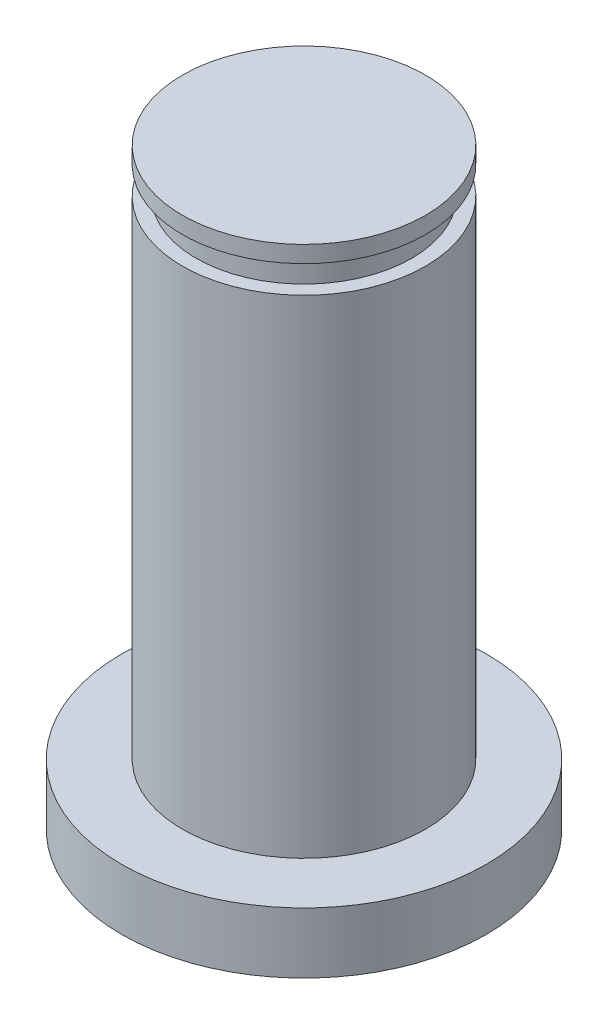
ISO-10303-21;
HEADER;
FILE_DESCRIPTION(('STEP AP214'),'2;1');
FILE_NAME('part.step','',(''),(''),'','','');
FILE_SCHEMA(('AUTOMOTIVE_DESIGN { 1 0 10303 214 1 1 1 1 }'));
ENDSEC;
DATA;
#1=APPLICATION_CONTEXT('core data for automotive mechanical design processes');
#2=APPLICATION_PROTOCOL_DEFINITION('international standard','automotive_design',2000,#1);
#3=PRODUCT_CONTEXT('',#1,'mechanical');
#4=PRODUCT('Part','Part','',(#3));
#5=PRODUCT_RELATED_PRODUCT_CATEGORY('part','',(#4));
#6=PRODUCT_DEFINITION_FORMATION('','',#4);
#7=PRODUCT_DEFINITION_CONTEXT('part definition',#1,'design');
#8=PRODUCT_DEFINITION('design','',#6,#7);
#9=PRODUCT_DEFINITION_SHAPE('','',#8);
#10=(LENGTH_UNIT() NAMED_UNIT(*) SI_UNIT(.MILLI.,.METRE.));
#11=(NAMED_UNIT(*) PLANE_ANGLE_UNIT() SI_UNIT($,.RADIAN.));
#12=(NAMED_UNIT(*) SI_UNIT($,.STERADIAN.) SOLID_ANGLE_UNIT());
#13=UNCERTAINTY_MEASURE_WITH_UNIT(LENGTH_MEASURE(1.E-05),#10,'distance_accuracy_value','');
#14=(GEOMETRIC_REPRESENTATION_CONTEXT(3) GLOBAL_UNCERTAINTY_ASSIGNED_CONTEXT((#13)) GLOBAL_UNIT_ASSIGNED_CONTEXT((#10,
#11,#12)) REPRESENTATION_CONTEXT('',''));
#15=CARTESIAN_POINT('',(0.,0.,0.));
#16=DIRECTION('',(0.,0.,1.));
#17=DIRECTION('',(1.,0.,0.));
#18=AXIS2_PLACEMENT_3D('',#15,#16,#17);
#19=CARTESIAN_POINT('',(65.,-142.5,100.));
#20=DIRECTION('',(0.,-1.,0.));
#21=DIRECTION('',(-1.,0.,0.));
#22=AXIS2_PLACEMENT_3D('',#19,#20,#21);
#23=PLANE('',#22);
#24=CARTESIAN_POINT('',(65.,-142.5,100.));
#25=DIRECTION('',(0.,-1.,0.));
#26=DIRECTION('',(1.,0.,0.));
#27=AXIS2_PLACEMENT_3D('',#24,#25,#26);
#28=CIRCLE('',#27,4.);
#29=CARTESIAN_POINT('',(69.,-142.5,100.));
#30=VERTEX_POINT('',#29);
#31=EDGE_CURVE('E11',#30,#30,#28,.T.);
#32=ORIENTED_EDGE('',*,*,#31,.F.);
#33=EDGE_LOOP('',(#32));
#34=FACE_BOUND('',#33,.T.);
#35=ADVANCED_FACE('F16',(#34),#23,.F.);
#36=CARTESIAN_POINT('',(65.,-142.5,100.));
#37=DIRECTION('',(0.,-1.,0.));
#38=DIRECTION('',(1.,0.,0.));
#39=AXIS2_PLACEMENT_3D('',#36,#37,#38);
#40=CYLINDRICAL_SURFACE('',#39,4.);
#41=CARTESIAN_POINT('',(65.,-143.05,100.));
#42=DIRECTION('',(0.,-1.,0.));
#43=DIRECTION('',(1.,0.,0.));
#44=AXIS2_PLACEMENT_3D('',#41,#42,#43);
#45=CIRCLE('',#44,4.);
#46=CARTESIAN_POINT('',(69.,-143.05,100.));
#47=VERTEX_POINT('',#46);
#48=EDGE_CURVE('E68',#47,#47,#45,.T.);
#49=ORIENTED_EDGE('',*,*,#48,.F.);
#50=DIRECTION('',(0.,-1.,0.));
#51=VECTOR('',#50,1.);
#52=CARTESIAN_POINT('',(69.,-142.5,100.));
#53=LINE('',#52,#51);
#54=EDGE_CURVE('E26',#30,#47,#53,.T.);
#55=ORIENTED_EDGE('',*,*,#54,.F.);
#56=ORIENTED_EDGE('',*,*,#31,.T.);
#57=ORIENTED_EDGE('',*,*,#54,.T.);
#58=EDGE_LOOP('',(#49,#55,#56,#57));
#59=FACE_BOUND('',#58,.T.);
#60=ADVANCED_FACE('F18',(#59),#40,.T.);
#61=CARTESIAN_POINT('',(65.,-143.05,100.));
#62=DIRECTION('',(0.,-1.,0.));
#63=DIRECTION('',(-1.,0.,0.));
#64=AXIS2_PLACEMENT_3D('',#61,#62,#63);
#65=PLANE('',#64);
#66=CARTESIAN_POINT('',(65.,-143.05,100.));
#67=DIRECTION('',(0.,-1.,0.));
#68=DIRECTION('',(1.,0.,0.));
#69=AXIS2_PLACEMENT_3D('',#66,#67,#68);
#70=CIRCLE('',#69,3.55);
#71=CARTESIAN_POINT('',(68.55,-143.05,100.));
#72=VERTEX_POINT('',#71);
#73=EDGE_CURVE('E64',#72,#72,#70,.T.);
#74=ORIENTED_EDGE('',*,*,#73,.F.);
#75=EDGE_LOOP('',(#74));
#76=FACE_BOUND('',#75,.T.);
#77=ORIENTED_EDGE('',*,*,#48,.T.);
#78=EDGE_LOOP('',(#77));
#79=FACE_BOUND('',#78,.T.);
#80=ADVANCED_FACE('F134',(#76,#79),#65,.T.);
#81=CARTESIAN_POINT('',(65.,-142.95,100.));
#82=DIRECTION('',(0.,-1.,0.));
#83=DIRECTION('',(1.,0.,0.));
#84=AXIS2_PLACEMENT_3D('',#81,#82,#83);
#85=CYLINDRICAL_SURFACE('',#84,3.55);
#86=CARTESIAN_POINT('',(65.,-143.95,100.));
#87=DIRECTION('',(0.,-1.,0.));
#88=DIRECTION('',(1.,0.,0.));
#89=AXIS2_PLACEMENT_3D('',#86,#87,#88);
#90=CIRCLE('',#89,3.55);
#91=CARTESIAN_POINT('',(68.55,-143.95,100.));
#92=VERTEX_POINT('',#91);
#93=EDGE_CURVE('E74',#92,#92,#90,.T.);
#94=ORIENTED_EDGE('',*,*,#93,.F.);
#95=DIRECTION('',(0.,-1.,0.));
#96=VECTOR('',#95,1.);
#97=CARTESIAN_POINT('',(68.55,-142.95,100.));
#98=LINE('',#97,#96);
#99=EDGE_CURVE('E59',#72,#92,#98,.T.);
#100=ORIENTED_EDGE('',*,*,#99,.F.);
#101=ORIENTED_EDGE('',*,*,#73,.T.);
#102=ORIENTED_EDGE('',*,*,#99,.T.);
#103=EDGE_LOOP('',(#94,#100,#101,#102));
#104=FACE_BOUND('',#103,.T.);
#105=ADVANCED_FACE('F65',(#104),#85,.T.);
#106=CARTESIAN_POINT('',(65.,-143.95,100.));
#107=DIRECTION('',(0.,-1.,0.));
#108=DIRECTION('',(-1.,0.,0.));
#109=AXIS2_PLACEMENT_3D('',#106,#107,#108);
#110=PLANE('',#109);
#111=ORIENTED_EDGE('',*,*,#93,.T.);
#112=EDGE_LOOP('',(#111));
#113=FACE_BOUND('',#112,.T.);
#114=CARTESIAN_POINT('',(65.,-143.95,100.));
#115=DIRECTION('',(0.,-1.,0.));
#116=DIRECTION('',(1.,0.,0.));
#117=AXIS2_PLACEMENT_3D('',#114,#115,#116);
#118=CIRCLE('',#117,4.);
#119=CARTESIAN_POINT('',(69.,-143.95,100.));
#120=VERTEX_POINT('',#119);
#121=EDGE_CURVE('E79',#120,#120,#118,.T.);
#122=ORIENTED_EDGE('',*,*,#121,.F.);
#123=EDGE_LOOP('',(#122));
#124=FACE_BOUND('',#123,.T.);
#125=ADVANCED_FACE('F124',(#113,#124),#110,.F.);
#126=CARTESIAN_POINT('',(65.,-142.5,100.));
#127=DIRECTION('',(0.,-1.,0.));
#128=DIRECTION('',(1.,0.,0.));
#129=AXIS2_PLACEMENT_3D('',#126,#127,#128);
#130=CYLINDRICAL_SURFACE('',#129,4.);
#131=DIRECTION('',(0.,-1.,0.));
#132=VECTOR('',#131,1.);
#133=CARTESIAN_POINT('',(69.,-142.5,100.));
#134=LINE('',#133,#132);
#135=CARTESIAN_POINT('',(69.,-160.,100.));
#136=VERTEX_POINT('',#135);
#137=EDGE_CURVE('E82',#120,#136,#134,.T.);
#138=ORIENTED_EDGE('',*,*,#137,.T.);
#139=CARTESIAN_POINT('',(65.,-160.,100.));
#140=DIRECTION('',(0.,-1.,0.));
#141=DIRECTION('',(1.,0.,0.));
#142=AXIS2_PLACEMENT_3D('',#139,#140,#141);
#143=CIRCLE('',#142,4.);
#144=EDGE_CURVE('E85',#136,#136,#143,.T.);
#145=ORIENTED_EDGE('',*,*,#144,.F.);
#146=ORIENTED_EDGE('',*,*,#137,.F.);
#147=ORIENTED_EDGE('',*,*,#121,.T.);
#148=EDGE_LOOP('',(#138,#145,#146,#147));
#149=FACE_BOUND('',#148,.T.);
#150=ADVANCED_FACE('F115',(#149),#130,.T.);
#151=CARTESIAN_POINT('',(65.,-160.,100.));
#152=DIRECTION('',(0.,-1.,0.));
#153=DIRECTION('',(-1.,0.,0.));
#154=AXIS2_PLACEMENT_3D('',#151,#152,#153);
#155=PLANE('',#154);
#156=ORIENTED_EDGE('',*,*,#144,.T.);
#157=EDGE_LOOP('',(#156));
#158=FACE_BOUND('',#157,.T.);
#159=CARTESIAN_POINT('',(65.,-160.,100.));
#160=DIRECTION('',(0.,-1.,0.));
#161=DIRECTION('',(1.,0.,0.));
#162=AXIS2_PLACEMENT_3D('',#159,#160,#161);
#163=CIRCLE('',#162,6.);
#164=CARTESIAN_POINT('',(71.,-160.,100.));
#165=VERTEX_POINT('',#164);
#166=EDGE_CURVE('E89',#165,#165,#163,.T.);
#167=ORIENTED_EDGE('',*,*,#166,.F.);
#168=EDGE_LOOP('',(#167));
#169=FACE_BOUND('',#168,.T.);
#170=ADVANCED_FACE('F113',(#158,#169),#155,.F.);
#171=CARTESIAN_POINT('',(65.,-162.,100.));
#172=DIRECTION('',(0.,-1.,0.));
#173=DIRECTION('',(-1.,0.,0.));
#174=AXIS2_PLACEMENT_3D('',#171,#172,#173);
#175=PLANE('',#174);
#176=CARTESIAN_POINT('',(65.,-162.,100.));
#177=DIRECTION('',(0.,-1.,0.));
#178=DIRECTION('',(1.,0.,0.));
#179=AXIS2_PLACEMENT_3D('',#176,#177,#178);
#180=CIRCLE('',#179,6.);
#181=CARTESIAN_POINT('',(71.,-162.,100.));
#182=VERTEX_POINT('',#181);
#183=EDGE_CURVE('E97',#182,#182,#180,.T.);
#184=ORIENTED_EDGE('',*,*,#183,.T.);
#185=EDGE_LOOP('',(#184));
#186=FACE_BOUND('',#185,.T.);
#187=ADVANCED_FACE('F106',(#186),#175,.T.);
#188=CARTESIAN_POINT('',(65.,-160.,100.));
#189=DIRECTION('',(0.,-1.,0.));
#190=DIRECTION('',(1.,0.,0.));
#191=AXIS2_PLACEMENT_3D('',#188,#189,#190);
#192=CYLINDRICAL_SURFACE('',#191,6.);
#193=ORIENTED_EDGE('',*,*,#183,.F.);
#194=DIRECTION('',(0.,-1.,0.));
#195=VECTOR('',#194,1.);
#196=CARTESIAN_POINT('',(71.,-160.,100.));
#197=LINE('',#196,#195);
#198=EDGE_CURVE('E92',#165,#182,#197,.T.);
#199=ORIENTED_EDGE('',*,*,#198,.F.);
#200=ORIENTED_EDGE('',*,*,#166,.T.);
#201=ORIENTED_EDGE('',*,*,#198,.T.);
#202=EDGE_LOOP('',(#193,#199,#200,#201));
#203=FACE_BOUND('',#202,.T.);
#204=ADVANCED_FACE('F110',(#203),#192,.T.);
#205=CLOSED_SHELL('',(#35,#60,#80,#105,#125,#150,#170,#187,#204));
#206=MANIFOLD_SOLID_BREP('B1',#205);
#207=ADVANCED_BREP_SHAPE_REPRESENTATION('',(#18,#206),#14);
#208=SHAPE_DEFINITION_REPRESENTATION(#9,#207);
ENDSEC;
END-ISO-10303-21;
